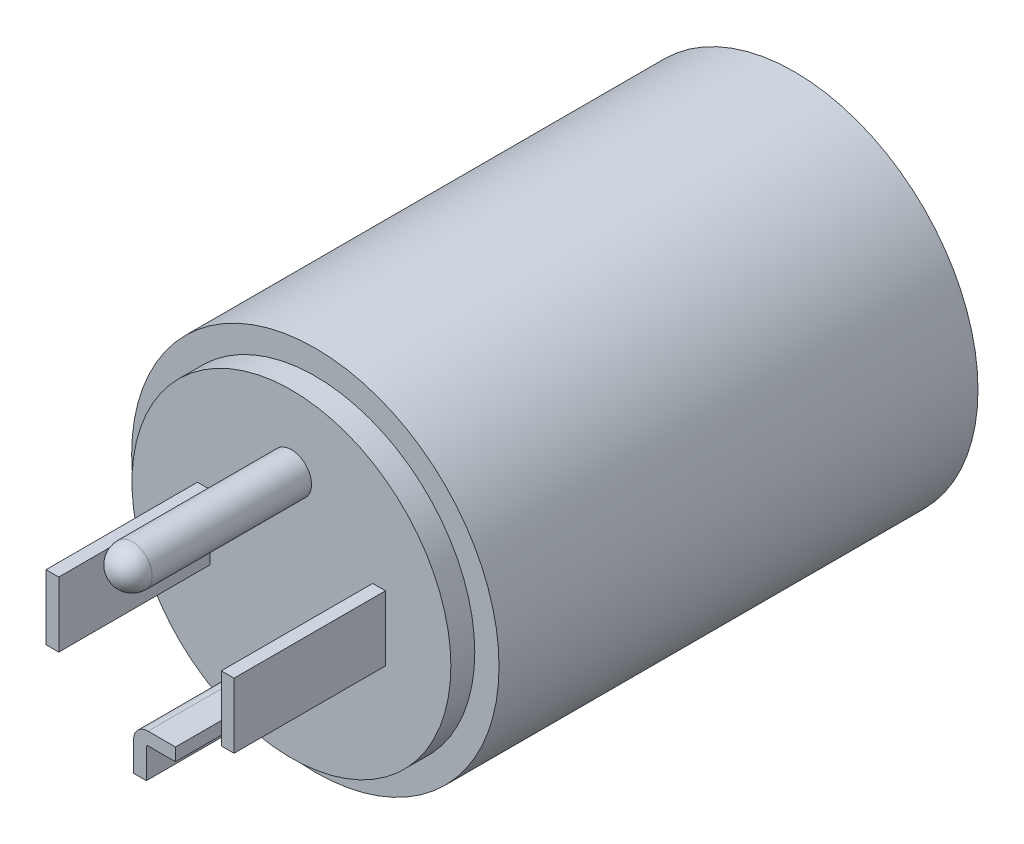
ISO-10303-21;
HEADER;
FILE_DESCRIPTION(('STEP AP214'),'2;1');
FILE_NAME('part.step','',(''),(''),'','','');
FILE_SCHEMA(('AUTOMOTIVE_DESIGN { 1 0 10303 214 1 1 1 1 }'));
ENDSEC;
DATA;
#1=APPLICATION_CONTEXT('core data for automotive mechanical design processes');
#2=APPLICATION_PROTOCOL_DEFINITION('international standard','automotive_design',2000,#1);
#3=PRODUCT_CONTEXT('',#1,'mechanical');
#4=PRODUCT('Part','Part','',(#3));
#5=PRODUCT_RELATED_PRODUCT_CATEGORY('part','',(#4));
#6=PRODUCT_DEFINITION_FORMATION('','',#4);
#7=PRODUCT_DEFINITION_CONTEXT('part definition',#1,'design');
#8=PRODUCT_DEFINITION('design','',#6,#7);
#9=PRODUCT_DEFINITION_SHAPE('','',#8);
#10=(LENGTH_UNIT() NAMED_UNIT(*) SI_UNIT(.MILLI.,.METRE.));
#11=(NAMED_UNIT(*) PLANE_ANGLE_UNIT() SI_UNIT($,.RADIAN.));
#12=(NAMED_UNIT(*) SI_UNIT($,.STERADIAN.) SOLID_ANGLE_UNIT());
#13=UNCERTAINTY_MEASURE_WITH_UNIT(LENGTH_MEASURE(1.E-05),#10,'distance_accuracy_value','');
#14=(GEOMETRIC_REPRESENTATION_CONTEXT(3) GLOBAL_UNCERTAINTY_ASSIGNED_CONTEXT((#13)) GLOBAL_UNIT_ASSIGNED_CONTEXT((#10,
#11,#12)) REPRESENTATION_CONTEXT('',''));
#15=CARTESIAN_POINT('',(0.,0.,0.));
#16=DIRECTION('',(0.,0.,1.));
#17=DIRECTION('',(1.,0.,0.));
#18=AXIS2_PLACEMENT_3D('',#15,#16,#17);
#19=CARTESIAN_POINT('',(0.,0.,0.));
#20=DIRECTION('',(0.,0.,-1.));
#21=DIRECTION('',(-1.,0.,0.));
#22=AXIS2_PLACEMENT_3D('',#19,#20,#21);
#23=PLANE('',#22);
#24=CARTESIAN_POINT('',(0.,0.,0.));
#25=DIRECTION('',(0.,0.,1.));
#26=DIRECTION('',(1.,0.,0.));
#27=AXIS2_PLACEMENT_3D('',#24,#25,#26);
#28=CIRCLE('',#27,31.75);
#29=CARTESIAN_POINT('',(31.75,0.,0.));
#30=VERTEX_POINT('',#29);
#31=EDGE_CURVE('P0_E9',#30,#30,#28,.T.);
#32=ORIENTED_EDGE('',*,*,#31,.T.);
#33=EDGE_LOOP('',(#32));
#34=FACE_BOUND('',#33,.T.);
#35=ADVANCED_FACE('P0_F14',(#34),#23,.F.);
#36=CARTESIAN_POINT('',(0.,0.,0.));
#37=DIRECTION('',(0.,0.,1.));
#38=DIRECTION('',(1.,0.,0.));
#39=AXIS2_PLACEMENT_3D('',#36,#37,#38);
#40=CYLINDRICAL_SURFACE('',#39,31.75);
#41=ORIENTED_EDGE('',*,*,#31,.F.);
#42=EDGE_LOOP('',(#41));
#43=FACE_BOUND('',#42,.T.);
#44=CARTESIAN_POINT('',(0.,0.,-4.7625));
#45=DIRECTION('',(0.,0.,1.));
#46=DIRECTION('',(1.,0.,0.));
#47=AXIS2_PLACEMENT_3D('',#44,#45,#46);
#48=CIRCLE('',#47,31.75);
#49=CARTESIAN_POINT('',(31.75,0.,-4.7625));
#50=VERTEX_POINT('',#49);
#51=EDGE_CURVE('P0_E20',#50,#50,#48,.T.);
#52=ORIENTED_EDGE('',*,*,#51,.T.);
#53=EDGE_LOOP('',(#52));
#54=FACE_BOUND('',#53,.T.);
#55=ADVANCED_FACE('P0_F51',(#43,#54),#40,.T.);
#56=CARTESIAN_POINT('',(0.,31.75,-4.7625));
#57=DIRECTION('',(0.,0.,-1.));
#58=DIRECTION('',(-1.,0.,0.));
#59=AXIS2_PLACEMENT_3D('',#56,#57,#58);
#60=PLANE('',#59);
#61=ORIENTED_EDGE('',*,*,#51,.F.);
#62=EDGE_LOOP('',(#61));
#63=FACE_BOUND('',#62,.T.);
#64=CARTESIAN_POINT('',(0.,0.,-4.7625));
#65=DIRECTION('',(0.,0.,1.));
#66=DIRECTION('',(1.,0.,0.));
#67=AXIS2_PLACEMENT_3D('',#64,#65,#66);
#68=CIRCLE('',#67,36.576);
#69=CARTESIAN_POINT('',(36.576,0.,-4.7625));
#70=VERTEX_POINT('',#69);
#71=EDGE_CURVE('P0_E24',#70,#70,#68,.T.);
#72=ORIENTED_EDGE('',*,*,#71,.T.);
#73=EDGE_LOOP('',(#72));
#74=FACE_BOUND('',#73,.T.);
#75=ADVANCED_FACE('P0_F56',(#63,#74),#60,.F.);
#76=CARTESIAN_POINT('',(0.,0.,0.));
#77=DIRECTION('',(0.,0.,1.));
#78=DIRECTION('',(1.,0.,0.));
#79=AXIS2_PLACEMENT_3D('',#76,#77,#78);
#80=CYLINDRICAL_SURFACE('',#79,36.576);
#81=ORIENTED_EDGE('',*,*,#71,.F.);
#82=EDGE_LOOP('',(#81));
#83=FACE_BOUND('',#82,.T.);
#84=CARTESIAN_POINT('',(0.,0.,-100.1395));
#85=DIRECTION('',(0.,0.,1.));
#86=DIRECTION('',(1.,0.,0.));
#87=AXIS2_PLACEMENT_3D('',#84,#85,#86);
#88=CIRCLE('',#87,36.576);
#89=CARTESIAN_POINT('',(36.576,0.,-100.1395));
#90=VERTEX_POINT('',#89);
#91=EDGE_CURVE('P0_E28',#90,#90,#88,.T.);
#92=ORIENTED_EDGE('',*,*,#91,.T.);
#93=EDGE_LOOP('',(#92));
#94=FACE_BOUND('',#93,.T.);
#95=ADVANCED_FACE('P0_F47',(#83,#94),#80,.T.);
#96=CARTESIAN_POINT('',(0.,0.,-104.902));
#97=DIRECTION('',(0.,0.,1.));
#98=DIRECTION('',(1.,0.,0.));
#99=AXIS2_PLACEMENT_3D('',#96,#97,#98);
#100=CONICAL_SURFACE('',#99,18.8021080289528,1.30899693899575);
#101=ORIENTED_EDGE('',*,*,#91,.F.);
#102=EDGE_LOOP('',(#101));
#103=FACE_BOUND('',#102,.T.);
#104=CARTESIAN_POINT('',(0.,0.,-104.902));
#105=DIRECTION('',(0.,0.,1.));
#106=DIRECTION('',(1.,0.,0.));
#107=AXIS2_PLACEMENT_3D('',#104,#105,#106);
#108=CIRCLE('',#107,18.8021080289528);
#109=CARTESIAN_POINT('',(18.8021080289528,0.,-104.902));
#110=VERTEX_POINT('',#109);
#111=EDGE_CURVE('P0_E33',#110,#110,#108,.T.);
#112=ORIENTED_EDGE('',*,*,#111,.T.);
#113=EDGE_LOOP('',(#112));
#114=FACE_BOUND('',#113,.T.);
#115=ADVANCED_FACE('P0_F37',(#103,#114),#100,.T.);
#116=CARTESIAN_POINT('',(0.,18.8021080289528,-104.902));
#117=DIRECTION('',(0.,0.,1.));
#118=DIRECTION('',(1.,0.,0.));
#119=AXIS2_PLACEMENT_3D('',#116,#117,#118);
#120=PLANE('',#119);
#121=ORIENTED_EDGE('',*,*,#111,.F.);
#122=EDGE_LOOP('',(#121));
#123=FACE_BOUND('',#122,.T.);
#124=ADVANCED_FACE('P0_F39',(#123),#120,.F.);
#125=CLOSED_SHELL('',(#35,#55,#75,#95,#115,#124));
#126=MANIFOLD_SOLID_BREP('P0_B1',#125);
#127=CARTESIAN_POINT('',(-18.7198,6.477,30.1498));
#128=DIRECTION('',(0.,-1.,0.));
#129=DIRECTION('',(1.,0.,0.));
#130=AXIS2_PLACEMENT_3D('',#127,#128,#129);
#131=PLANE('',#130);
#132=DIRECTION('',(-1.,0.,0.));
#133=VECTOR('',#132,1.);
#134=CARTESIAN_POINT('',(-18.7198,6.477,0.));
#135=LINE('',#134,#133);
#136=CARTESIAN_POINT('',(-16.1798,6.477,0.));
#137=VERTEX_POINT('',#136);
#138=CARTESIAN_POINT('',(-18.7198,6.477,0.));
#139=VERTEX_POINT('',#138);
#140=EDGE_CURVE('P1_E80',#137,#139,#135,.T.);
#141=ORIENTED_EDGE('',*,*,#140,.T.);
#142=DIRECTION('',(0.,0.,-1.));
#143=VECTOR('',#142,1.);
#144=CARTESIAN_POINT('',(-18.7198,6.477,30.1498));
#145=LINE('',#144,#143);
#146=CARTESIAN_POINT('',(-18.7198,6.477,30.1498));
#147=VERTEX_POINT('',#146);
#148=EDGE_CURVE('P1_E11',#147,#139,#145,.T.);
#149=ORIENTED_EDGE('',*,*,#148,.F.);
#150=DIRECTION('',(-1.,0.,0.));
#151=VECTOR('',#150,1.);
#152=CARTESIAN_POINT('',(-18.7198,6.477,30.1498));
#153=LINE('',#152,#151);
#154=CARTESIAN_POINT('',(-16.1798,6.477,30.1498));
#155=VERTEX_POINT('',#154);
#156=EDGE_CURVE('P1_E68',#155,#147,#153,.T.);
#157=ORIENTED_EDGE('',*,*,#156,.F.);
#158=DIRECTION('',(0.,0.,-1.));
#159=VECTOR('',#158,1.);
#160=CARTESIAN_POINT('',(-16.1798,6.477,30.1498));
#161=LINE('',#160,#159);
#162=EDGE_CURVE('P1_E76',#155,#137,#161,.T.);
#163=ORIENTED_EDGE('',*,*,#162,.T.);
#164=EDGE_LOOP('',(#141,#149,#157,#163));
#165=FACE_BOUND('',#164,.T.);
#166=ADVANCED_FACE('P1_F17',(#165),#131,.F.);
#167=CARTESIAN_POINT('',(-18.7198,6.477,30.1498));
#168=DIRECTION('',(1.,0.,0.));
#169=DIRECTION('',(0.,0.,-1.));
#170=AXIS2_PLACEMENT_3D('',#167,#168,#169);
#171=PLANE('',#170);
#172=DIRECTION('',(0.,-1.,0.));
#173=VECTOR('',#172,1.);
#174=CARTESIAN_POINT('',(-18.7198,6.477,0.));
#175=LINE('',#174,#173);
#176=CARTESIAN_POINT('',(-18.7198,-6.477,0.));
#177=VERTEX_POINT('',#176);
#178=EDGE_CURVE('P1_E72',#139,#177,#175,.T.);
#179=ORIENTED_EDGE('',*,*,#178,.T.);
#180=DIRECTION('',(0.,0.,-1.));
#181=VECTOR('',#180,1.);
#182=CARTESIAN_POINT('',(-18.7198,-6.477,30.1498));
#183=LINE('',#182,#181);
#184=CARTESIAN_POINT('',(-18.7198,-6.477,30.1498));
#185=VERTEX_POINT('',#184);
#186=EDGE_CURVE('P1_E25',#185,#177,#183,.T.);
#187=ORIENTED_EDGE('',*,*,#186,.F.);
#188=DIRECTION('',(0.,-1.,0.));
#189=VECTOR('',#188,1.);
#190=CARTESIAN_POINT('',(-18.7198,6.477,30.1498));
#191=LINE('',#190,#189);
#192=EDGE_CURVE('P1_E63',#147,#185,#191,.T.);
#193=ORIENTED_EDGE('',*,*,#192,.F.);
#194=ORIENTED_EDGE('',*,*,#148,.T.);
#195=EDGE_LOOP('',(#179,#187,#193,#194));
#196=FACE_BOUND('',#195,.T.);
#197=ADVANCED_FACE('P1_F71',(#196),#171,.F.);
#198=CARTESIAN_POINT('',(-18.7198,-6.477,30.1498));
#199=DIRECTION('',(0.,1.,0.));
#200=DIRECTION('',(-1.,0.,0.));
#201=AXIS2_PLACEMENT_3D('',#198,#199,#200);
#202=PLANE('',#201);
#203=DIRECTION('',(1.,0.,0.));
#204=VECTOR('',#203,1.);
#205=CARTESIAN_POINT('',(-18.7198,-6.477,0.));
#206=LINE('',#205,#204);
#207=CARTESIAN_POINT('',(-16.1798,-6.477,0.));
#208=VERTEX_POINT('',#207);
#209=EDGE_CURVE('P1_E50',#177,#208,#206,.T.);
#210=ORIENTED_EDGE('',*,*,#209,.T.);
#211=DIRECTION('',(0.,0.,-1.));
#212=VECTOR('',#211,1.);
#213=CARTESIAN_POINT('',(-16.1798,-6.477,30.1498));
#214=LINE('',#213,#212);
#215=CARTESIAN_POINT('',(-16.1798,-6.477,30.1498));
#216=VERTEX_POINT('',#215);
#217=EDGE_CURVE('P1_E73',#216,#208,#214,.T.);
#218=ORIENTED_EDGE('',*,*,#217,.F.);
#219=DIRECTION('',(1.,0.,0.));
#220=VECTOR('',#219,1.);
#221=CARTESIAN_POINT('',(-18.7198,-6.477,30.1498));
#222=LINE('',#221,#220);
#223=EDGE_CURVE('P1_E66',#185,#216,#222,.T.);
#224=ORIENTED_EDGE('',*,*,#223,.F.);
#225=ORIENTED_EDGE('',*,*,#186,.T.);
#226=EDGE_LOOP('',(#210,#218,#224,#225));
#227=FACE_BOUND('',#226,.T.);
#228=ADVANCED_FACE('P1_F74',(#227),#202,.F.);
#229=CARTESIAN_POINT('',(-16.1798,6.477,30.1498));
#230=DIRECTION('',(-1.,0.,0.));
#231=DIRECTION('',(0.,0.,1.));
#232=AXIS2_PLACEMENT_3D('',#229,#230,#231);
#233=PLANE('',#232);
#234=DIRECTION('',(0.,1.,0.));
#235=VECTOR('',#234,1.);
#236=CARTESIAN_POINT('',(-16.1798,6.477,0.));
#237=LINE('',#236,#235);
#238=EDGE_CURVE('P1_E56',#208,#137,#237,.T.);
#239=ORIENTED_EDGE('',*,*,#238,.T.);
#240=ORIENTED_EDGE('',*,*,#162,.F.);
#241=DIRECTION('',(0.,1.,0.));
#242=VECTOR('',#241,1.);
#243=CARTESIAN_POINT('',(-16.1798,6.477,30.1498));
#244=LINE('',#243,#242);
#245=EDGE_CURVE('P1_E33',#216,#155,#244,.T.);
#246=ORIENTED_EDGE('',*,*,#245,.F.);
#247=ORIENTED_EDGE('',*,*,#217,.T.);
#248=EDGE_LOOP('',(#239,#240,#246,#247));
#249=FACE_BOUND('',#248,.T.);
#250=ADVANCED_FACE('P1_F87',(#249),#233,.F.);
#251=CARTESIAN_POINT('',(-16.1798,6.477,30.1498));
#252=DIRECTION('',(0.,0.,-1.));
#253=DIRECTION('',(-1.,0.,0.));
#254=AXIS2_PLACEMENT_3D('',#251,#252,#253);
#255=PLANE('',#254);
#256=ORIENTED_EDGE('',*,*,#156,.T.);
#257=ORIENTED_EDGE('',*,*,#192,.T.);
#258=ORIENTED_EDGE('',*,*,#223,.T.);
#259=ORIENTED_EDGE('',*,*,#245,.T.);
#260=EDGE_LOOP('',(#256,#257,#258,#259));
#261=FACE_BOUND('',#260,.T.);
#262=ADVANCED_FACE('P1_F64',(#261),#255,.F.);
#263=CARTESIAN_POINT('',(-16.1798,6.477,0.));
#264=DIRECTION('',(0.,0.,-1.));
#265=DIRECTION('',(-1.,0.,0.));
#266=AXIS2_PLACEMENT_3D('',#263,#264,#265);
#267=PLANE('',#266);
#268=ORIENTED_EDGE('',*,*,#140,.F.);
#269=ORIENTED_EDGE('',*,*,#238,.F.);
#270=ORIENTED_EDGE('',*,*,#209,.F.);
#271=ORIENTED_EDGE('',*,*,#178,.F.);
#272=EDGE_LOOP('',(#268,#269,#270,#271));
#273=FACE_BOUND('',#272,.T.);
#274=ADVANCED_FACE('P1_F90',(#273),#267,.T.);
#275=CLOSED_SHELL('',(#166,#197,#228,#250,#262,#274));
#276=MANIFOLD_SOLID_BREP('P1_B1',#275);
#277=CARTESIAN_POINT('',(18.7198,6.477,30.1498));
#278=DIRECTION('',(0.,-1.,0.));
#279=DIRECTION('',(0.,0.,-1.));
#280=AXIS2_PLACEMENT_3D('',#277,#278,#279);
#281=PLANE('',#280);
#282=DIRECTION('',(-1.,0.,0.));
#283=VECTOR('',#282,1.);
#284=CARTESIAN_POINT('',(18.7198,6.477,0.));
#285=LINE('',#284,#283);
#286=CARTESIAN_POINT('',(18.7198,6.477,0.));
#287=VERTEX_POINT('',#286);
#288=CARTESIAN_POINT('',(16.1798,6.477,0.));
#289=VERTEX_POINT('',#288);
#290=EDGE_CURVE('P2_E80',#287,#289,#285,.T.);
#291=ORIENTED_EDGE('',*,*,#290,.T.);
#292=DIRECTION('',(0.,0.,-1.));
#293=VECTOR('',#292,1.);
#294=CARTESIAN_POINT('',(16.1798,6.477,30.1498));
#295=LINE('',#294,#293);
#296=CARTESIAN_POINT('',(16.1798,6.477,30.1498));
#297=VERTEX_POINT('',#296);
#298=EDGE_CURVE('P2_E11',#297,#289,#295,.T.);
#299=ORIENTED_EDGE('',*,*,#298,.F.);
#300=DIRECTION('',(-1.,0.,0.));
#301=VECTOR('',#300,1.);
#302=CARTESIAN_POINT('',(18.7198,6.477,30.1498));
#303=LINE('',#302,#301);
#304=CARTESIAN_POINT('',(18.7198,6.477,30.1498));
#305=VERTEX_POINT('',#304);
#306=EDGE_CURVE('P2_E68',#305,#297,#303,.T.);
#307=ORIENTED_EDGE('',*,*,#306,.F.);
#308=DIRECTION('',(0.,0.,-1.));
#309=VECTOR('',#308,1.);
#310=CARTESIAN_POINT('',(18.7198,6.477,30.1498));
#311=LINE('',#310,#309);
#312=EDGE_CURVE('P2_E76',#305,#287,#311,.T.);
#313=ORIENTED_EDGE('',*,*,#312,.T.);
#314=EDGE_LOOP('',(#291,#299,#307,#313));
#315=FACE_BOUND('',#314,.T.);
#316=ADVANCED_FACE('P2_F17',(#315),#281,.F.);
#317=CARTESIAN_POINT('',(16.1798,6.477,30.1498));
#318=DIRECTION('',(1.,0.,0.));
#319=DIRECTION('',(0.,0.,-1.));
#320=AXIS2_PLACEMENT_3D('',#317,#318,#319);
#321=PLANE('',#320);
#322=DIRECTION('',(0.,-1.,0.));
#323=VECTOR('',#322,1.);
#324=CARTESIAN_POINT('',(16.1798,6.477,0.));
#325=LINE('',#324,#323);
#326=CARTESIAN_POINT('',(16.1798,-6.477,0.));
#327=VERTEX_POINT('',#326);
#328=EDGE_CURVE('P2_E72',#289,#327,#325,.T.);
#329=ORIENTED_EDGE('',*,*,#328,.T.);
#330=DIRECTION('',(0.,0.,-1.));
#331=VECTOR('',#330,1.);
#332=CARTESIAN_POINT('',(16.1798,-6.477,30.1498));
#333=LINE('',#332,#331);
#334=CARTESIAN_POINT('',(16.1798,-6.477,30.1498));
#335=VERTEX_POINT('',#334);
#336=EDGE_CURVE('P2_E25',#335,#327,#333,.T.);
#337=ORIENTED_EDGE('',*,*,#336,.F.);
#338=DIRECTION('',(0.,-1.,0.));
#339=VECTOR('',#338,1.);
#340=CARTESIAN_POINT('',(16.1798,6.477,30.1498));
#341=LINE('',#340,#339);
#342=EDGE_CURVE('P2_E63',#297,#335,#341,.T.);
#343=ORIENTED_EDGE('',*,*,#342,.F.);
#344=ORIENTED_EDGE('',*,*,#298,.T.);
#345=EDGE_LOOP('',(#329,#337,#343,#344));
#346=FACE_BOUND('',#345,.T.);
#347=ADVANCED_FACE('P2_F71',(#346),#321,.F.);
#348=CARTESIAN_POINT('',(18.7198,-6.477,30.1498));
#349=DIRECTION('',(0.,1.,0.));
#350=DIRECTION('',(0.,0.,1.));
#351=AXIS2_PLACEMENT_3D('',#348,#349,#350);
#352=PLANE('',#351);
#353=DIRECTION('',(1.,0.,0.));
#354=VECTOR('',#353,1.);
#355=CARTESIAN_POINT('',(18.7198,-6.477,0.));
#356=LINE('',#355,#354);
#357=CARTESIAN_POINT('',(18.7198,-6.477,0.));
#358=VERTEX_POINT('',#357);
#359=EDGE_CURVE('P2_E50',#327,#358,#356,.T.);
#360=ORIENTED_EDGE('',*,*,#359,.T.);
#361=DIRECTION('',(0.,0.,-1.));
#362=VECTOR('',#361,1.);
#363=CARTESIAN_POINT('',(18.7198,-6.477,30.1498));
#364=LINE('',#363,#362);
#365=CARTESIAN_POINT('',(18.7198,-6.477,30.1498));
#366=VERTEX_POINT('',#365);
#367=EDGE_CURVE('P2_E73',#366,#358,#364,.T.);
#368=ORIENTED_EDGE('',*,*,#367,.F.);
#369=DIRECTION('',(1.,0.,0.));
#370=VECTOR('',#369,1.);
#371=CARTESIAN_POINT('',(18.7198,-6.477,30.1498));
#372=LINE('',#371,#370);
#373=EDGE_CURVE('P2_E66',#335,#366,#372,.T.);
#374=ORIENTED_EDGE('',*,*,#373,.F.);
#375=ORIENTED_EDGE('',*,*,#336,.T.);
#376=EDGE_LOOP('',(#360,#368,#374,#375));
#377=FACE_BOUND('',#376,.T.);
#378=ADVANCED_FACE('P2_F74',(#377),#352,.F.);
#379=CARTESIAN_POINT('',(18.7198,6.477,30.1498));
#380=DIRECTION('',(-1.,0.,0.));
#381=DIRECTION('',(0.,0.,1.));
#382=AXIS2_PLACEMENT_3D('',#379,#380,#381);
#383=PLANE('',#382);
#384=DIRECTION('',(0.,1.,0.));
#385=VECTOR('',#384,1.);
#386=CARTESIAN_POINT('',(18.7198,6.477,0.));
#387=LINE('',#386,#385);
#388=EDGE_CURVE('P2_E56',#358,#287,#387,.T.);
#389=ORIENTED_EDGE('',*,*,#388,.T.);
#390=ORIENTED_EDGE('',*,*,#312,.F.);
#391=DIRECTION('',(0.,1.,0.));
#392=VECTOR('',#391,1.);
#393=CARTESIAN_POINT('',(18.7198,6.477,30.1498));
#394=LINE('',#393,#392);
#395=EDGE_CURVE('P2_E33',#366,#305,#394,.T.);
#396=ORIENTED_EDGE('',*,*,#395,.F.);
#397=ORIENTED_EDGE('',*,*,#367,.T.);
#398=EDGE_LOOP('',(#389,#390,#396,#397));
#399=FACE_BOUND('',#398,.T.);
#400=ADVANCED_FACE('P2_F87',(#399),#383,.F.);
#401=CARTESIAN_POINT('',(16.1798,6.477,30.1498));
#402=DIRECTION('',(0.,0.,1.));
#403=DIRECTION('',(1.,0.,0.));
#404=AXIS2_PLACEMENT_3D('',#401,#402,#403);
#405=PLANE('',#404);
#406=ORIENTED_EDGE('',*,*,#306,.T.);
#407=ORIENTED_EDGE('',*,*,#342,.T.);
#408=ORIENTED_EDGE('',*,*,#373,.T.);
#409=ORIENTED_EDGE('',*,*,#395,.T.);
#410=EDGE_LOOP('',(#406,#407,#408,#409));
#411=FACE_BOUND('',#410,.T.);
#412=ADVANCED_FACE('P2_F64',(#411),#405,.T.);
#413=CARTESIAN_POINT('',(16.1798,6.477,0.));
#414=DIRECTION('',(0.,0.,1.));
#415=DIRECTION('',(1.,0.,0.));
#416=AXIS2_PLACEMENT_3D('',#413,#414,#415);
#417=PLANE('',#416);
#418=ORIENTED_EDGE('',*,*,#290,.F.);
#419=ORIENTED_EDGE('',*,*,#388,.F.);
#420=ORIENTED_EDGE('',*,*,#359,.F.);
#421=ORIENTED_EDGE('',*,*,#328,.F.);
#422=EDGE_LOOP('',(#418,#419,#420,#421));
#423=FACE_BOUND('',#422,.T.);
#424=ADVANCED_FACE('P2_F90',(#423),#417,.F.);
#425=CLOSED_SHELL('',(#316,#347,#378,#400,#412,#424));
#426=MANIFOLD_SOLID_BREP('P2_B1',#425);
#427=CARTESIAN_POINT('',(0.,17.4498,0.));
#428=DIRECTION('',(0.,0.,-1.));
#429=DIRECTION('',(0.,1.,0.));
#430=AXIS2_PLACEMENT_3D('',#427,#428,#429);
#431=PLANE('',#430);
#432=CARTESIAN_POINT('',(0.,17.4498,0.));
#433=DIRECTION('',(0.,0.,-1.));
#434=DIRECTION('',(0.,1.,0.));
#435=AXIS2_PLACEMENT_3D('',#432,#433,#434);
#436=CIRCLE('',#435,4.0005);
#437=CARTESIAN_POINT('',(0.,21.4503,0.));
#438=VERTEX_POINT('',#437);
#439=EDGE_CURVE('P3_E21',#438,#438,#436,.T.);
#440=ORIENTED_EDGE('',*,*,#439,.T.);
#441=EDGE_LOOP('',(#440));
#442=FACE_BOUND('',#441,.T.);
#443=ADVANCED_FACE('P3_F15',(#442),#431,.T.);
#444=CARTESIAN_POINT('',(0.,17.4498,31.7119));
#445=DIRECTION('',(0.,0.,-1.));
#446=DIRECTION('',(0.,1.,0.));
#447=AXIS2_PLACEMENT_3D('',#444,#445,#446);
#448=SPHERICAL_SURFACE('',#447,4.0005);
#449=CARTESIAN_POINT('',(0.,17.4498,31.7119));
#450=DIRECTION('',(0.,0.,-1.));
#451=DIRECTION('',(0.,1.,0.));
#452=AXIS2_PLACEMENT_3D('',#449,#450,#451);
#453=CIRCLE('',#452,4.0005);
#454=CARTESIAN_POINT('',(0.,21.4503,31.7119));
#455=VERTEX_POINT('',#454);
#456=EDGE_CURVE('P3_E10',#455,#455,#453,.T.);
#457=ORIENTED_EDGE('',*,*,#456,.F.);
#458=EDGE_LOOP('',(#457));
#459=FACE_BOUND('',#458,.T.);
#460=ADVANCED_FACE('P3_F30',(#459),#448,.T.);
#461=CARTESIAN_POINT('',(0.,17.4498,0.));
#462=DIRECTION('',(0.,0.,-1.));
#463=DIRECTION('',(0.,1.,0.));
#464=AXIS2_PLACEMENT_3D('',#461,#462,#463);
#465=CYLINDRICAL_SURFACE('',#464,4.0005);
#466=ORIENTED_EDGE('',*,*,#456,.T.);
#467=EDGE_LOOP('',(#466));
#468=FACE_BOUND('',#467,.T.);
#469=ORIENTED_EDGE('',*,*,#439,.F.);
#470=EDGE_LOOP('',(#469));
#471=FACE_BOUND('',#470,.T.);
#472=ADVANCED_FACE('P3_F28',(#468,#471),#465,.T.);
#473=CLOSED_SHELL('',(#443,#460,#472));
#474=MANIFOLD_SOLID_BREP('P3_B1',#473);
#475=CARTESIAN_POINT('',(1.5875,-14.0716,30.1498));
#476=DIRECTION('',(0.,0.,-1.));
#477=DIRECTION('',(-1.,0.,0.));
#478=AXIS2_PLACEMENT_3D('',#475,#476,#477);
#479=CYLINDRICAL_SURFACE('',#478,2.8575);
#480=CARTESIAN_POINT('',(1.5875,-14.0716,0.));
#481=DIRECTION('',(0.,0.,1.));
#482=DIRECTION('',(1.,0.,0.));
#483=AXIS2_PLACEMENT_3D('',#480,#481,#482);
#484=CIRCLE('',#483,2.8575);
#485=CARTESIAN_POINT('',(1.5875,-11.2141,0.));
#486=VERTEX_POINT('',#485);
#487=CARTESIAN_POINT('',(-1.27,-14.0716,0.));
#488=VERTEX_POINT('',#487);
#489=EDGE_CURVE('P4_E113',#486,#488,#484,.T.);
#490=ORIENTED_EDGE('',*,*,#489,.T.);
#491=DIRECTION('',(0.,0.,-1.));
#492=VECTOR('',#491,1.);
#493=CARTESIAN_POINT('',(-1.27,-14.0716,30.1498));
#494=LINE('',#493,#492);
#495=CARTESIAN_POINT('',(-1.27,-14.0716,30.1498));
#496=VERTEX_POINT('',#495);
#497=EDGE_CURVE('P4_E11',#496,#488,#494,.T.);
#498=ORIENTED_EDGE('',*,*,#497,.F.);
#499=CARTESIAN_POINT('',(1.5875,-14.0716,30.1498));
#500=DIRECTION('',(0.,0.,1.));
#501=DIRECTION('',(1.,0.,0.));
#502=AXIS2_PLACEMENT_3D('',#499,#500,#501);
#503=CIRCLE('',#502,2.8575);
#504=CARTESIAN_POINT('',(1.5875,-11.2141,30.1498));
#505=VERTEX_POINT('',#504);
#506=EDGE_CURVE('P4_E127',#505,#496,#503,.T.);
#507=ORIENTED_EDGE('',*,*,#506,.F.);
#508=DIRECTION('',(0.,0.,-1.));
#509=VECTOR('',#508,1.);
#510=CARTESIAN_POINT('',(1.5875,-11.2141,30.1498));
#511=LINE('',#510,#509);
#512=EDGE_CURVE('P4_E109',#505,#486,#511,.T.);
#513=ORIENTED_EDGE('',*,*,#512,.T.);
#514=EDGE_LOOP('',(#490,#498,#507,#513));
#515=FACE_BOUND('',#514,.T.);
#516=ADVANCED_FACE('P4_F17',(#515),#479,.T.);
#517=CARTESIAN_POINT('',(-1.27,-14.0716,30.1498));
#518=DIRECTION('',(1.,0.,0.));
#519=DIRECTION('',(0.,1.,0.));
#520=AXIS2_PLACEMENT_3D('',#517,#518,#519);
#521=PLANE('',#520);
#522=DIRECTION('',(0.,-1.,0.));
#523=VECTOR('',#522,1.);
#524=CARTESIAN_POINT('',(-1.27,-14.0716,0.));
#525=LINE('',#524,#523);
#526=CARTESIAN_POINT('',(-1.27,-19.9263,0.));
#527=VERTEX_POINT('',#526);
#528=EDGE_CURVE('P4_E116',#488,#527,#525,.T.);
#529=ORIENTED_EDGE('',*,*,#528,.T.);
#530=DIRECTION('',(0.,0.,-1.));
#531=VECTOR('',#530,1.);
#532=CARTESIAN_POINT('',(-1.27,-19.9263,30.1498));
#533=LINE('',#532,#531);
#534=CARTESIAN_POINT('',(-1.27,-19.9263,30.1498));
#535=VERTEX_POINT('',#534);
#536=EDGE_CURVE('P4_E25',#535,#527,#533,.T.);
#537=ORIENTED_EDGE('',*,*,#536,.F.);
#538=DIRECTION('',(0.,-1.,0.));
#539=VECTOR('',#538,1.);
#540=CARTESIAN_POINT('',(-1.27,-14.0716,30.1498));
#541=LINE('',#540,#539);
#542=EDGE_CURVE('P4_E76',#496,#535,#541,.T.);
#543=ORIENTED_EDGE('',*,*,#542,.F.);
#544=ORIENTED_EDGE('',*,*,#497,.T.);
#545=EDGE_LOOP('',(#529,#537,#543,#544));
#546=FACE_BOUND('',#545,.T.);
#547=ADVANCED_FACE('P4_F162',(#546),#521,.F.);
#548=CARTESIAN_POINT('',(-1.27,-19.9263,30.1498));
#549=DIRECTION('',(0.,1.,0.));
#550=DIRECTION('',(0.,0.,1.));
#551=AXIS2_PLACEMENT_3D('',#548,#549,#550);
#552=PLANE('',#551);
#553=DIRECTION('',(1.,0.,0.));
#554=VECTOR('',#553,1.);
#555=CARTESIAN_POINT('',(-1.27,-19.9263,0.));
#556=LINE('',#555,#554);
#557=CARTESIAN_POINT('',(1.27,-19.9263,0.));
#558=VERTEX_POINT('',#557);
#559=EDGE_CURVE('P4_E118',#527,#558,#556,.T.);
#560=ORIENTED_EDGE('',*,*,#559,.T.);
#561=DIRECTION('',(0.,0.,-1.));
#562=VECTOR('',#561,1.);
#563=CARTESIAN_POINT('',(1.27,-19.9263,30.1498));
#564=LINE('',#563,#562);
#565=CARTESIAN_POINT('',(1.27,-19.9263,30.1498));
#566=VERTEX_POINT('',#565);
#567=EDGE_CURVE('P4_E134',#566,#558,#564,.T.);
#568=ORIENTED_EDGE('',*,*,#567,.F.);
#569=DIRECTION('',(1.,0.,0.));
#570=VECTOR('',#569,1.);
#571=CARTESIAN_POINT('',(-1.27,-19.9263,30.1498));
#572=LINE('',#571,#570);
#573=EDGE_CURVE('P4_E142',#535,#566,#572,.T.);
#574=ORIENTED_EDGE('',*,*,#573,.F.);
#575=ORIENTED_EDGE('',*,*,#536,.T.);
#576=EDGE_LOOP('',(#560,#568,#574,#575));
#577=FACE_BOUND('',#576,.T.);
#578=ADVANCED_FACE('P4_F140',(#577),#552,.F.);
#579=CARTESIAN_POINT('',(1.27,-19.9263,30.1498));
#580=DIRECTION('',(-1.,0.,0.));
#581=DIRECTION('',(0.,-1.,0.));
#582=AXIS2_PLACEMENT_3D('',#579,#580,#581);
#583=PLANE('',#582);
#584=DIRECTION('',(0.,1.,0.));
#585=VECTOR('',#584,1.);
#586=CARTESIAN_POINT('',(1.27,-19.9263,0.));
#587=LINE('',#586,#585);
#588=CARTESIAN_POINT('',(1.27,-14.0716,0.));
#589=VERTEX_POINT('',#588);
#590=EDGE_CURVE('P4_E120',#558,#589,#587,.T.);
#591=ORIENTED_EDGE('',*,*,#590,.T.);
#592=DIRECTION('',(0.,0.,-1.));
#593=VECTOR('',#592,1.);
#594=CARTESIAN_POINT('',(1.27,-14.0716,30.1498));
#595=LINE('',#594,#593);
#596=CARTESIAN_POINT('',(1.27,-14.0716,30.1498));
#597=VERTEX_POINT('',#596);
#598=EDGE_CURVE('P4_E131',#597,#589,#595,.T.);
#599=ORIENTED_EDGE('',*,*,#598,.F.);
#600=DIRECTION('',(0.,1.,0.));
#601=VECTOR('',#600,1.);
#602=CARTESIAN_POINT('',(1.27,-19.9263,30.1498));
#603=LINE('',#602,#601);
#604=EDGE_CURVE('P4_E154',#566,#597,#603,.T.);
#605=ORIENTED_EDGE('',*,*,#604,.F.);
#606=ORIENTED_EDGE('',*,*,#567,.T.);
#607=EDGE_LOOP('',(#591,#599,#605,#606));
#608=FACE_BOUND('',#607,.T.);
#609=ADVANCED_FACE('P4_F150',(#608),#583,.F.);
#610=CARTESIAN_POINT('',(1.5875,-14.0716,30.1498));
#611=DIRECTION('',(0.,0.,-1.));
#612=DIRECTION('',(-1.,0.,0.));
#613=AXIS2_PLACEMENT_3D('',#610,#611,#612);
#614=CYLINDRICAL_SURFACE('',#613,0.317499999999999);
#615=CARTESIAN_POINT('',(1.5875,-14.0716,0.));
#616=DIRECTION('',(0.,0.,-1.));
#617=DIRECTION('',(1.,0.,0.));
#618=AXIS2_PLACEMENT_3D('',#615,#616,#617);
#619=CIRCLE('',#618,0.317499999999999);
#620=CARTESIAN_POINT('',(1.5875,-13.7541,0.));
#621=VERTEX_POINT('',#620);
#622=EDGE_CURVE('P4_E122',#589,#621,#619,.T.);
#623=ORIENTED_EDGE('',*,*,#622,.T.);
#624=DIRECTION('',(0.,0.,-1.));
#625=VECTOR('',#624,1.);
#626=CARTESIAN_POINT('',(1.5875,-13.7541,30.1498));
#627=LINE('',#626,#625);
#628=CARTESIAN_POINT('',(1.5875,-13.7541,30.1498));
#629=VERTEX_POINT('',#628);
#630=EDGE_CURVE('P4_E104',#629,#621,#627,.T.);
#631=ORIENTED_EDGE('',*,*,#630,.F.);
#632=CARTESIAN_POINT('',(1.5875,-14.0716,30.1498));
#633=DIRECTION('',(0.,0.,-1.));
#634=DIRECTION('',(1.,0.,0.));
#635=AXIS2_PLACEMENT_3D('',#632,#633,#634);
#636=CIRCLE('',#635,0.317499999999999);
#637=EDGE_CURVE('P4_E95',#597,#629,#636,.T.);
#638=ORIENTED_EDGE('',*,*,#637,.F.);
#639=ORIENTED_EDGE('',*,*,#598,.T.);
#640=EDGE_LOOP('',(#623,#631,#638,#639));
#641=FACE_BOUND('',#640,.T.);
#642=ADVANCED_FACE('P4_F153',(#641),#614,.F.);
#643=CARTESIAN_POINT('',(1.5875,-13.7541,30.1498));
#644=DIRECTION('',(0.,1.,0.));
#645=DIRECTION('',(-1.,0.,0.));
#646=AXIS2_PLACEMENT_3D('',#643,#644,#645);
#647=PLANE('',#646);
#648=DIRECTION('',(1.,0.,0.));
#649=VECTOR('',#648,1.);
#650=CARTESIAN_POINT('',(1.5875,-13.7541,0.));
#651=LINE('',#650,#649);
#652=CARTESIAN_POINT('',(7.0612,-13.7541,0.));
#653=VERTEX_POINT('',#652);
#654=EDGE_CURVE('P4_E103',#621,#653,#651,.T.);
#655=ORIENTED_EDGE('',*,*,#654,.T.);
#656=DIRECTION('',(0.,0.,-1.));
#657=VECTOR('',#656,1.);
#658=CARTESIAN_POINT('',(7.0612,-13.7541,30.1498));
#659=LINE('',#658,#657);
#660=CARTESIAN_POINT('',(7.0612,-13.7541,30.1498));
#661=VERTEX_POINT('',#660);
#662=EDGE_CURVE('P4_E100',#661,#653,#659,.T.);
#663=ORIENTED_EDGE('',*,*,#662,.F.);
#664=DIRECTION('',(1.,0.,0.));
#665=VECTOR('',#664,1.);
#666=CARTESIAN_POINT('',(1.5875,-13.7541,30.1498));
#667=LINE('',#666,#665);
#668=EDGE_CURVE('P4_E89',#629,#661,#667,.T.);
#669=ORIENTED_EDGE('',*,*,#668,.F.);
#670=ORIENTED_EDGE('',*,*,#630,.T.);
#671=EDGE_LOOP('',(#655,#663,#669,#670));
#672=FACE_BOUND('',#671,.T.);
#673=ADVANCED_FACE('P4_F101',(#672),#647,.F.);
#674=CARTESIAN_POINT('',(7.0612,-13.7541,30.1498));
#675=DIRECTION('',(-1.,0.,0.));
#676=DIRECTION('',(0.,0.,1.));
#677=AXIS2_PLACEMENT_3D('',#674,#675,#676);
#678=PLANE('',#677);
#679=DIRECTION('',(0.,1.,0.));
#680=VECTOR('',#679,1.);
#681=CARTESIAN_POINT('',(7.0612,-13.7541,0.));
#682=LINE('',#681,#680);
#683=CARTESIAN_POINT('',(7.0612,-11.2141,0.));
#684=VERTEX_POINT('',#683);
#685=EDGE_CURVE('P4_E62',#653,#684,#682,.T.);
#686=ORIENTED_EDGE('',*,*,#685,.T.);
#687=DIRECTION('',(0.,0.,-1.));
#688=VECTOR('',#687,1.);
#689=CARTESIAN_POINT('',(7.0612,-11.2141,30.1498));
#690=LINE('',#689,#688);
#691=CARTESIAN_POINT('',(7.0612,-11.2141,30.1498));
#692=VERTEX_POINT('',#691);
#693=EDGE_CURVE('P4_E105',#692,#684,#690,.T.);
#694=ORIENTED_EDGE('',*,*,#693,.F.);
#695=DIRECTION('',(0.,1.,0.));
#696=VECTOR('',#695,1.);
#697=CARTESIAN_POINT('',(7.0612,-13.7541,30.1498));
#698=LINE('',#697,#696);
#699=EDGE_CURVE('P4_E93',#661,#692,#698,.T.);
#700=ORIENTED_EDGE('',*,*,#699,.F.);
#701=ORIENTED_EDGE('',*,*,#662,.T.);
#702=EDGE_LOOP('',(#686,#694,#700,#701));
#703=FACE_BOUND('',#702,.T.);
#704=ADVANCED_FACE('P4_F107',(#703),#678,.F.);
#705=CARTESIAN_POINT('',(7.0612,-11.2141,30.1498));
#706=DIRECTION('',(0.,-1.,0.));
#707=DIRECTION('',(0.,0.,-1.));
#708=AXIS2_PLACEMENT_3D('',#705,#706,#707);
#709=PLANE('',#708);
#710=DIRECTION('',(-1.,0.,0.));
#711=VECTOR('',#710,1.);
#712=CARTESIAN_POINT('',(7.0612,-11.2141,0.));
#713=LINE('',#712,#711);
#714=EDGE_CURVE('P4_E68',#684,#486,#713,.T.);
#715=ORIENTED_EDGE('',*,*,#714,.T.);
#716=ORIENTED_EDGE('',*,*,#512,.F.);
#717=DIRECTION('',(-1.,0.,0.));
#718=VECTOR('',#717,1.);
#719=CARTESIAN_POINT('',(7.0612,-11.2141,30.1498));
#720=LINE('',#719,#718);
#721=EDGE_CURVE('P4_E33',#692,#505,#720,.T.);
#722=ORIENTED_EDGE('',*,*,#721,.F.);
#723=ORIENTED_EDGE('',*,*,#693,.T.);
#724=EDGE_LOOP('',(#715,#716,#722,#723));
#725=FACE_BOUND('',#724,.T.);
#726=ADVANCED_FACE('P4_F180',(#725),#709,.F.);
#727=CARTESIAN_POINT('',(1.5875,-14.0716,30.1498));
#728=DIRECTION('',(0.,0.,1.));
#729=DIRECTION('',(1.,0.,0.));
#730=AXIS2_PLACEMENT_3D('',#727,#728,#729);
#731=PLANE('',#730);
#732=ORIENTED_EDGE('',*,*,#506,.T.);
#733=ORIENTED_EDGE('',*,*,#542,.T.);
#734=ORIENTED_EDGE('',*,*,#573,.T.);
#735=ORIENTED_EDGE('',*,*,#604,.T.);
#736=ORIENTED_EDGE('',*,*,#637,.T.);
#737=ORIENTED_EDGE('',*,*,#668,.T.);
#738=ORIENTED_EDGE('',*,*,#699,.T.);
#739=ORIENTED_EDGE('',*,*,#721,.T.);
#740=EDGE_LOOP('',(#732,#733,#734,#735,#736,#737,#738,#739));
#741=FACE_BOUND('',#740,.T.);
#742=ADVANCED_FACE('P4_F91',(#741),#731,.T.);
#743=CARTESIAN_POINT('',(1.5875,-14.0716,0.));
#744=DIRECTION('',(0.,0.,1.));
#745=DIRECTION('',(1.,0.,0.));
#746=AXIS2_PLACEMENT_3D('',#743,#744,#745);
#747=PLANE('',#746);
#748=ORIENTED_EDGE('',*,*,#489,.F.);
#749=ORIENTED_EDGE('',*,*,#714,.F.);
#750=ORIENTED_EDGE('',*,*,#685,.F.);
#751=ORIENTED_EDGE('',*,*,#654,.F.);
#752=ORIENTED_EDGE('',*,*,#622,.F.);
#753=ORIENTED_EDGE('',*,*,#590,.F.);
#754=ORIENTED_EDGE('',*,*,#559,.F.);
#755=ORIENTED_EDGE('',*,*,#528,.F.);
#756=EDGE_LOOP('',(#748,#749,#750,#751,#752,#753,#754,#755));
#757=FACE_BOUND('',#756,.T.);
#758=ADVANCED_FACE('P4_F146',(#757),#747,.F.);
#759=CLOSED_SHELL('',(#516,#547,#578,#609,#642,#673,#704,#726,#742,#758));
#760=MANIFOLD_SOLID_BREP('P4_B1',#759);
#761=ADVANCED_BREP_SHAPE_REPRESENTATION('',(#18,#126,#276,#426,#474,#760),#14);
#762=SHAPE_DEFINITION_REPRESENTATION(#9,#761);
ENDSEC;
END-ISO-10303-21;
